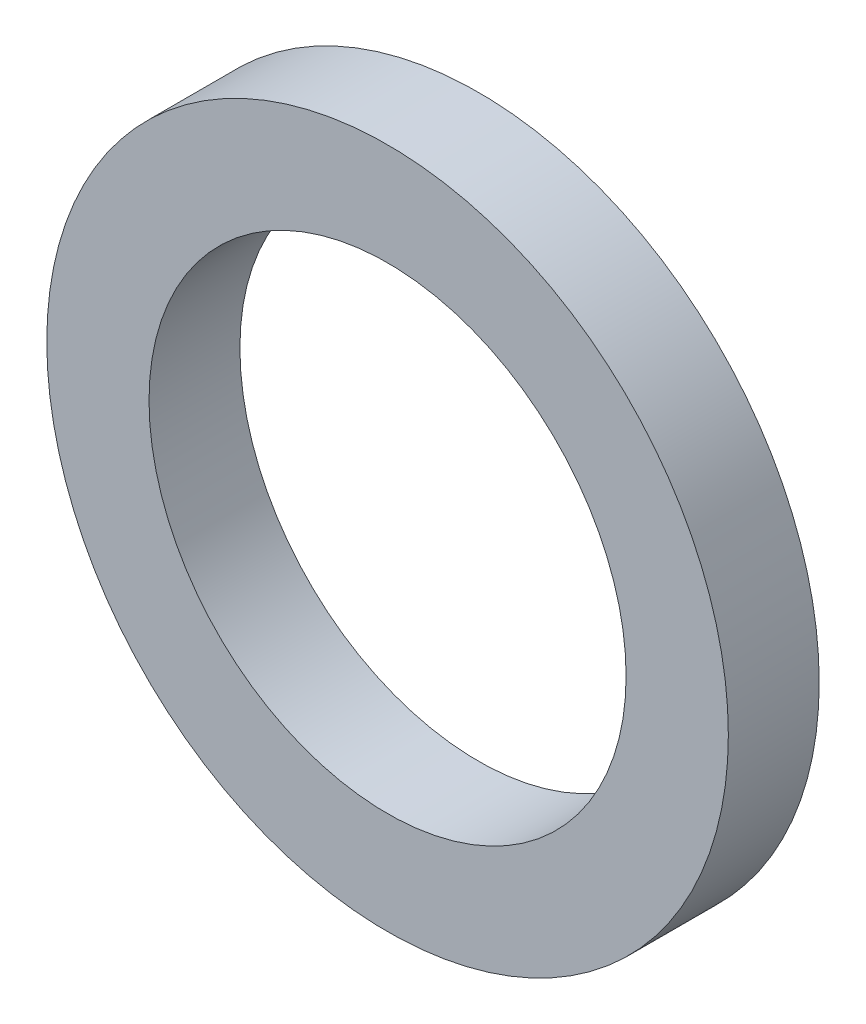
ISO-10303-21;
HEADER;
FILE_DESCRIPTION(('STEP AP214'),'2;1');
FILE_NAME('part.step','',(''),(''),'','','');
FILE_SCHEMA(('AUTOMOTIVE_DESIGN { 1 0 10303 214 1 1 1 1 }'));
ENDSEC;
DATA;
#1=APPLICATION_CONTEXT('core data for automotive mechanical design processes');
#2=APPLICATION_PROTOCOL_DEFINITION('international standard','automotive_design',2000,#1);
#3=PRODUCT_CONTEXT('',#1,'mechanical');
#4=PRODUCT('Part','Part','',(#3));
#5=PRODUCT_RELATED_PRODUCT_CATEGORY('part','',(#4));
#6=PRODUCT_DEFINITION_FORMATION('','',#4);
#7=PRODUCT_DEFINITION_CONTEXT('part definition',#1,'design');
#8=PRODUCT_DEFINITION('design','',#6,#7);
#9=PRODUCT_DEFINITION_SHAPE('','',#8);
#10=(LENGTH_UNIT() NAMED_UNIT(*) SI_UNIT(.MILLI.,.METRE.));
#11=(NAMED_UNIT(*) PLANE_ANGLE_UNIT() SI_UNIT($,.RADIAN.));
#12=(NAMED_UNIT(*) SI_UNIT($,.STERADIAN.) SOLID_ANGLE_UNIT());
#13=UNCERTAINTY_MEASURE_WITH_UNIT(LENGTH_MEASURE(1.E-05),#10,'distance_accuracy_value','');
#14=(GEOMETRIC_REPRESENTATION_CONTEXT(3) GLOBAL_UNCERTAINTY_ASSIGNED_CONTEXT((#13)) GLOBAL_UNIT_ASSIGNED_CONTEXT((#10,
#11,#12)) REPRESENTATION_CONTEXT('',''));
#15=CARTESIAN_POINT('',(0.,0.,0.));
#16=DIRECTION('',(0.,0.,1.));
#17=DIRECTION('',(1.,0.,0.));
#18=AXIS2_PLACEMENT_3D('',#15,#16,#17);
#19=CARTESIAN_POINT('',(0.,0.,2.));
#20=DIRECTION('',(0.,0.,1.));
#21=DIRECTION('',(1.,0.,0.));
#22=AXIS2_PLACEMENT_3D('',#19,#20,#21);
#23=PLANE('',#22);
#24=CARTESIAN_POINT('',(0.,0.,2.));
#25=DIRECTION('',(0.,0.,1.));
#26=DIRECTION('',(1.,0.,0.));
#27=AXIS2_PLACEMENT_3D('',#24,#25,#26);
#28=CIRCLE('',#27,7.5);
#29=CARTESIAN_POINT('',(7.5,0.,2.));
#30=VERTEX_POINT('',#29);
#31=EDGE_CURVE('E10',#30,#30,#28,.T.);
#32=ORIENTED_EDGE('',*,*,#31,.T.);
#33=EDGE_LOOP('',(#32));
#34=FACE_BOUND('',#33,.T.);
#35=CARTESIAN_POINT('',(0.,0.,2.));
#36=DIRECTION('',(0.,0.,1.));
#37=DIRECTION('',(1.,0.,0.));
#38=AXIS2_PLACEMENT_3D('',#35,#36,#37);
#39=CIRCLE('',#38,5.25);
#40=CARTESIAN_POINT('',(5.25,0.,2.));
#41=VERTEX_POINT('',#40);
#42=EDGE_CURVE('E40',#41,#41,#39,.T.);
#43=ORIENTED_EDGE('',*,*,#42,.F.);
#44=EDGE_LOOP('',(#43));
#45=FACE_BOUND('',#44,.T.);
#46=ADVANCED_FACE('F29',(#34,#45),#23,.T.);
#47=CARTESIAN_POINT('',(0.,0.,0.));
#48=DIRECTION('',(0.,0.,1.));
#49=DIRECTION('',(1.,0.,0.));
#50=AXIS2_PLACEMENT_3D('',#47,#48,#49);
#51=PLANE('',#50);
#52=CARTESIAN_POINT('',(0.,0.,0.));
#53=DIRECTION('',(0.,0.,1.));
#54=DIRECTION('',(1.,0.,0.));
#55=AXIS2_PLACEMENT_3D('',#52,#53,#54);
#56=CIRCLE('',#55,7.5);
#57=CARTESIAN_POINT('',(7.5,0.,0.));
#58=VERTEX_POINT('',#57);
#59=EDGE_CURVE('E33',#58,#58,#56,.T.);
#60=ORIENTED_EDGE('',*,*,#59,.F.);
#61=EDGE_LOOP('',(#60));
#62=FACE_BOUND('',#61,.T.);
#63=CARTESIAN_POINT('',(0.,0.,0.));
#64=DIRECTION('',(0.,0.,1.));
#65=DIRECTION('',(1.,0.,0.));
#66=AXIS2_PLACEMENT_3D('',#63,#64,#65);
#67=CIRCLE('',#66,5.25);
#68=CARTESIAN_POINT('',(5.25,0.,0.));
#69=VERTEX_POINT('',#68);
#70=EDGE_CURVE('E42',#69,#69,#67,.T.);
#71=ORIENTED_EDGE('',*,*,#70,.T.);
#72=EDGE_LOOP('',(#71));
#73=FACE_BOUND('',#72,.T.);
#74=ADVANCED_FACE('F52',(#62,#73),#51,.F.);
#75=CARTESIAN_POINT('',(0.,0.,2.));
#76=DIRECTION('',(0.,0.,-1.));
#77=DIRECTION('',(-1.,0.,0.));
#78=AXIS2_PLACEMENT_3D('',#75,#76,#77);
#79=CYLINDRICAL_SURFACE('',#78,7.5);
#80=ORIENTED_EDGE('',*,*,#31,.F.);
#81=EDGE_LOOP('',(#80));
#82=FACE_BOUND('',#81,.T.);
#83=ORIENTED_EDGE('',*,*,#59,.T.);
#84=EDGE_LOOP('',(#83));
#85=FACE_BOUND('',#84,.T.);
#86=ADVANCED_FACE('F31',(#82,#85),#79,.T.);
#87=CARTESIAN_POINT('',(0.,0.,2.));
#88=DIRECTION('',(0.,0.,-1.));
#89=DIRECTION('',(-1.,0.,0.));
#90=AXIS2_PLACEMENT_3D('',#87,#88,#89);
#91=CYLINDRICAL_SURFACE('',#90,5.25);
#92=ORIENTED_EDGE('',*,*,#42,.T.);
#93=EDGE_LOOP('',(#92));
#94=FACE_BOUND('',#93,.T.);
#95=ORIENTED_EDGE('',*,*,#70,.F.);
#96=EDGE_LOOP('',(#95));
#97=FACE_BOUND('',#96,.T.);
#98=ADVANCED_FACE('F48',(#94,#97),#91,.F.);
#99=CLOSED_SHELL('',(#46,#74,#86,#98));
#100=MANIFOLD_SOLID_BREP('B2',#99);
#101=ADVANCED_BREP_SHAPE_REPRESENTATION('',(#18,#100),#14);
#102=SHAPE_DEFINITION_REPRESENTATION(#9,#101);
ENDSEC;
END-ISO-10303-21;
